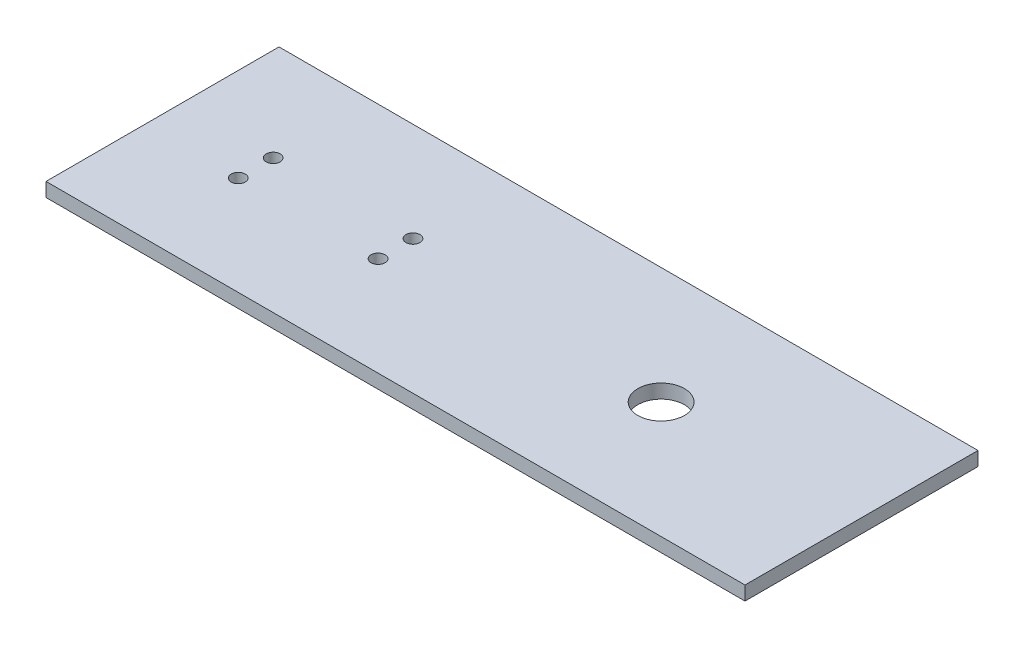
ISO-10303-21;
HEADER;
FILE_DESCRIPTION(('STEP AP214'),'2;1');
FILE_NAME('part.step','',(''),(''),'','','');
FILE_SCHEMA(('AUTOMOTIVE_DESIGN { 1 0 10303 214 1 1 1 1 }'));
ENDSEC;
DATA;
#1=APPLICATION_CONTEXT('core data for automotive mechanical design processes');
#2=APPLICATION_PROTOCOL_DEFINITION('international standard','automotive_design',2000,#1);
#3=PRODUCT_CONTEXT('',#1,'mechanical');
#4=PRODUCT('Part','Part','',(#3));
#5=PRODUCT_RELATED_PRODUCT_CATEGORY('part','',(#4));
#6=PRODUCT_DEFINITION_FORMATION('','',#4);
#7=PRODUCT_DEFINITION_CONTEXT('part definition',#1,'design');
#8=PRODUCT_DEFINITION('design','',#6,#7);
#9=PRODUCT_DEFINITION_SHAPE('','',#8);
#10=(LENGTH_UNIT() NAMED_UNIT(*) SI_UNIT(.MILLI.,.METRE.));
#11=(NAMED_UNIT(*) PLANE_ANGLE_UNIT() SI_UNIT($,.RADIAN.));
#12=(NAMED_UNIT(*) SI_UNIT($,.STERADIAN.) SOLID_ANGLE_UNIT());
#13=UNCERTAINTY_MEASURE_WITH_UNIT(LENGTH_MEASURE(1.E-05),#10,'distance_accuracy_value','');
#14=(GEOMETRIC_REPRESENTATION_CONTEXT(3) GLOBAL_UNCERTAINTY_ASSIGNED_CONTEXT((#13)) GLOBAL_UNIT_ASSIGNED_CONTEXT((#10,
#11,#12)) REPRESENTATION_CONTEXT('',''));
#15=CARTESIAN_POINT('',(0.,0.,0.));
#16=DIRECTION('',(0.,0.,1.));
#17=DIRECTION('',(1.,0.,0.));
#18=AXIS2_PLACEMENT_3D('',#15,#16,#17);
#19=CARTESIAN_POINT('',(75.,3.,25.));
#20=DIRECTION('',(-1.,0.,0.));
#21=DIRECTION('',(0.,0.,1.));
#22=AXIS2_PLACEMENT_3D('',#19,#20,#21);
#23=PLANE('',#22);
#24=DIRECTION('',(0.,0.,-1.));
#25=VECTOR('',#24,1.);
#26=CARTESIAN_POINT('',(75.,0.,25.));
#27=LINE('',#26,#25);
#28=CARTESIAN_POINT('',(75.,0.,25.));
#29=VERTEX_POINT('',#28);
#30=CARTESIAN_POINT('',(75.,0.,-25.));
#31=VERTEX_POINT('',#30);
#32=EDGE_CURVE('E106',#29,#31,#27,.T.);
#33=ORIENTED_EDGE('',*,*,#32,.T.);
#34=DIRECTION('',(0.,-1.,0.));
#35=VECTOR('',#34,1.);
#36=CARTESIAN_POINT('',(75.,3.,-25.));
#37=LINE('',#36,#35);
#38=CARTESIAN_POINT('',(75.,3.,-25.));
#39=VERTEX_POINT('',#38);
#40=EDGE_CURVE('E11',#39,#31,#37,.T.);
#41=ORIENTED_EDGE('',*,*,#40,.F.);
#42=DIRECTION('',(0.,0.,-1.));
#43=VECTOR('',#42,1.);
#44=CARTESIAN_POINT('',(75.,3.,25.));
#45=LINE('',#44,#43);
#46=CARTESIAN_POINT('',(75.,3.,25.));
#47=VERTEX_POINT('',#46);
#48=EDGE_CURVE('E90',#47,#39,#45,.T.);
#49=ORIENTED_EDGE('',*,*,#48,.F.);
#50=DIRECTION('',(0.,-1.,0.));
#51=VECTOR('',#50,1.);
#52=CARTESIAN_POINT('',(75.,3.,25.));
#53=LINE('',#52,#51);
#54=EDGE_CURVE('E102',#47,#29,#53,.T.);
#55=ORIENTED_EDGE('',*,*,#54,.T.);
#56=EDGE_LOOP('',(#33,#41,#49,#55));
#57=FACE_BOUND('',#56,.T.);
#58=ADVANCED_FACE('F38',(#57),#23,.F.);
#59=CARTESIAN_POINT('',(-75.,3.,-25.));
#60=DIRECTION('',(0.,0.,1.));
#61=DIRECTION('',(1.,0.,0.));
#62=AXIS2_PLACEMENT_3D('',#59,#60,#61);
#63=PLANE('',#62);
#64=DIRECTION('',(-1.,0.,0.));
#65=VECTOR('',#64,1.);
#66=CARTESIAN_POINT('',(-75.,0.,-25.));
#67=LINE('',#66,#65);
#68=CARTESIAN_POINT('',(-75.,0.,-25.));
#69=VERTEX_POINT('',#68);
#70=EDGE_CURVE('E95',#31,#69,#67,.T.);
#71=ORIENTED_EDGE('',*,*,#70,.T.);
#72=DIRECTION('',(0.,-1.,0.));
#73=VECTOR('',#72,1.);
#74=CARTESIAN_POINT('',(-75.,3.,-25.));
#75=LINE('',#74,#73);
#76=CARTESIAN_POINT('',(-75.,3.,-25.));
#77=VERTEX_POINT('',#76);
#78=EDGE_CURVE('E47',#77,#69,#75,.T.);
#79=ORIENTED_EDGE('',*,*,#78,.F.);
#80=DIRECTION('',(-1.,0.,0.));
#81=VECTOR('',#80,1.);
#82=CARTESIAN_POINT('',(-75.,3.,-25.));
#83=LINE('',#82,#81);
#84=EDGE_CURVE('E85',#39,#77,#83,.T.);
#85=ORIENTED_EDGE('',*,*,#84,.F.);
#86=ORIENTED_EDGE('',*,*,#40,.T.);
#87=EDGE_LOOP('',(#71,#79,#85,#86));
#88=FACE_BOUND('',#87,.T.);
#89=ADVANCED_FACE('F94',(#88),#63,.F.);
#90=CARTESIAN_POINT('',(-75.,3.,25.));
#91=DIRECTION('',(1.,0.,0.));
#92=DIRECTION('',(0.,0.,-1.));
#93=AXIS2_PLACEMENT_3D('',#90,#91,#92);
#94=PLANE('',#93);
#95=DIRECTION('',(0.,0.,1.));
#96=VECTOR('',#95,1.);
#97=CARTESIAN_POINT('',(-75.,0.,25.));
#98=LINE('',#97,#96);
#99=CARTESIAN_POINT('',(-75.,0.,25.));
#100=VERTEX_POINT('',#99);
#101=EDGE_CURVE('E72',#69,#100,#98,.T.);
#102=ORIENTED_EDGE('',*,*,#101,.T.);
#103=DIRECTION('',(0.,-1.,0.));
#104=VECTOR('',#103,1.);
#105=CARTESIAN_POINT('',(-75.,3.,25.));
#106=LINE('',#105,#104);
#107=CARTESIAN_POINT('',(-75.,3.,25.));
#108=VERTEX_POINT('',#107);
#109=EDGE_CURVE('E97',#108,#100,#106,.T.);
#110=ORIENTED_EDGE('',*,*,#109,.F.);
#111=DIRECTION('',(0.,0.,1.));
#112=VECTOR('',#111,1.);
#113=CARTESIAN_POINT('',(-75.,3.,25.));
#114=LINE('',#113,#112);
#115=EDGE_CURVE('E88',#77,#108,#114,.T.);
#116=ORIENTED_EDGE('',*,*,#115,.F.);
#117=ORIENTED_EDGE('',*,*,#78,.T.);
#118=EDGE_LOOP('',(#102,#110,#116,#117));
#119=FACE_BOUND('',#118,.T.);
#120=ADVANCED_FACE('F98',(#119),#94,.F.);
#121=CARTESIAN_POINT('',(-75.,3.,25.));
#122=DIRECTION('',(0.,0.,-1.));
#123=DIRECTION('',(-1.,0.,0.));
#124=AXIS2_PLACEMENT_3D('',#121,#122,#123);
#125=PLANE('',#124);
#126=DIRECTION('',(1.,0.,0.));
#127=VECTOR('',#126,1.);
#128=CARTESIAN_POINT('',(-75.,0.,25.));
#129=LINE('',#128,#127);
#130=EDGE_CURVE('E78',#100,#29,#129,.T.);
#131=ORIENTED_EDGE('',*,*,#130,.T.);
#132=ORIENTED_EDGE('',*,*,#54,.F.);
#133=DIRECTION('',(1.,0.,0.));
#134=VECTOR('',#133,1.);
#135=CARTESIAN_POINT('',(-75.,3.,25.));
#136=LINE('',#135,#134);
#137=EDGE_CURVE('E55',#108,#47,#136,.T.);
#138=ORIENTED_EDGE('',*,*,#137,.F.);
#139=ORIENTED_EDGE('',*,*,#109,.T.);
#140=EDGE_LOOP('',(#131,#132,#138,#139));
#141=FACE_BOUND('',#140,.T.);
#142=ADVANCED_FACE('F120',(#141),#125,.F.);
#143=CARTESIAN_POINT('',(0.,3.,0.));
#144=DIRECTION('',(0.,-1.,0.));
#145=DIRECTION('',(0.,0.,-1.));
#146=AXIS2_PLACEMENT_3D('',#143,#144,#145);
#147=PLANE('',#146);
#148=CARTESIAN_POINT('',(32.,3.,0.));
#149=DIRECTION('',(0.,1.,0.));
#150=DIRECTION('',(0.,0.,1.));
#151=AXIS2_PLACEMENT_3D('',#148,#149,#150);
#152=CIRCLE('',#151,5.);
#153=CARTESIAN_POINT('',(32.,3.,5.));
#154=VERTEX_POINT('',#153);
#155=EDGE_CURVE('E159',#154,#154,#152,.T.);
#156=ORIENTED_EDGE('',*,*,#155,.F.);
#157=EDGE_LOOP('',(#156));
#158=FACE_BOUND('',#157,.T.);
#159=CARTESIAN_POINT('',(-25.,3.,-3.75));
#160=DIRECTION('',(0.,-1.,0.));
#161=DIRECTION('',(0.,0.,-1.));
#162=AXIS2_PLACEMENT_3D('',#159,#160,#161);
#163=CIRCLE('',#162,1.5);
#164=CARTESIAN_POINT('',(-25.,3.,-5.25));
#165=VERTEX_POINT('',#164);
#166=EDGE_CURVE('E110',#165,#165,#163,.T.);
#167=ORIENTED_EDGE('',*,*,#166,.T.);
#168=EDGE_LOOP('',(#167));
#169=FACE_BOUND('',#168,.T.);
#170=CARTESIAN_POINT('',(-25.,3.,3.75));
#171=DIRECTION('',(0.,-1.,0.));
#172=DIRECTION('',(0.,0.,-1.));
#173=AXIS2_PLACEMENT_3D('',#170,#171,#172);
#174=CIRCLE('',#173,1.5);
#175=CARTESIAN_POINT('',(-25.,3.,2.25));
#176=VERTEX_POINT('',#175);
#177=EDGE_CURVE('E130',#176,#176,#174,.T.);
#178=ORIENTED_EDGE('',*,*,#177,.T.);
#179=EDGE_LOOP('',(#178));
#180=FACE_BOUND('',#179,.T.);
#181=CARTESIAN_POINT('',(-55.,3.,3.75));
#182=DIRECTION('',(0.,-1.,0.));
#183=DIRECTION('',(0.,0.,-1.));
#184=AXIS2_PLACEMENT_3D('',#181,#182,#183);
#185=CIRCLE('',#184,1.5);
#186=CARTESIAN_POINT('',(-55.,3.,2.25));
#187=VERTEX_POINT('',#186);
#188=EDGE_CURVE('E134',#187,#187,#185,.T.);
#189=ORIENTED_EDGE('',*,*,#188,.T.);
#190=EDGE_LOOP('',(#189));
#191=FACE_BOUND('',#190,.T.);
#192=CARTESIAN_POINT('',(-55.,3.,-3.75));
#193=DIRECTION('',(0.,-1.,0.));
#194=DIRECTION('',(0.,0.,-1.));
#195=AXIS2_PLACEMENT_3D('',#192,#193,#194);
#196=CIRCLE('',#195,1.5);
#197=CARTESIAN_POINT('',(-55.,3.,-5.25));
#198=VERTEX_POINT('',#197);
#199=EDGE_CURVE('E138',#198,#198,#196,.T.);
#200=ORIENTED_EDGE('',*,*,#199,.T.);
#201=EDGE_LOOP('',(#200));
#202=FACE_BOUND('',#201,.T.);
#203=ORIENTED_EDGE('',*,*,#48,.T.);
#204=ORIENTED_EDGE('',*,*,#84,.T.);
#205=ORIENTED_EDGE('',*,*,#115,.T.);
#206=ORIENTED_EDGE('',*,*,#137,.T.);
#207=EDGE_LOOP('',(#203,#204,#205,#206));
#208=FACE_BOUND('',#207,.T.);
#209=ADVANCED_FACE('F86',(#158,#169,#180,#191,#202,#208),#147,.F.);
#210=CARTESIAN_POINT('',(0.,0.,0.));
#211=DIRECTION('',(0.,-1.,0.));
#212=DIRECTION('',(0.,0.,-1.));
#213=AXIS2_PLACEMENT_3D('',#210,#211,#212);
#214=PLANE('',#213);
#215=CARTESIAN_POINT('',(32.,0.,0.));
#216=DIRECTION('',(0.,1.,0.));
#217=DIRECTION('',(0.,0.,1.));
#218=AXIS2_PLACEMENT_3D('',#215,#216,#217);
#219=CIRCLE('',#218,5.);
#220=CARTESIAN_POINT('',(32.,0.,5.));
#221=VERTEX_POINT('',#220);
#222=EDGE_CURVE('E152',#221,#221,#219,.T.);
#223=ORIENTED_EDGE('',*,*,#222,.T.);
#224=EDGE_LOOP('',(#223));
#225=FACE_BOUND('',#224,.T.);
#226=CARTESIAN_POINT('',(-25.,0.,-3.75));
#227=DIRECTION('',(0.,1.,0.));
#228=DIRECTION('',(0.,0.,-1.));
#229=AXIS2_PLACEMENT_3D('',#226,#227,#228);
#230=CIRCLE('',#229,1.5);
#231=CARTESIAN_POINT('',(-25.,0.,-5.25));
#232=VERTEX_POINT('',#231);
#233=EDGE_CURVE('E147',#232,#232,#230,.T.);
#234=ORIENTED_EDGE('',*,*,#233,.T.);
#235=EDGE_LOOP('',(#234));
#236=FACE_BOUND('',#235,.T.);
#237=CARTESIAN_POINT('',(-25.,0.,3.75));
#238=DIRECTION('',(0.,1.,0.));
#239=DIRECTION('',(0.,0.,1.));
#240=AXIS2_PLACEMENT_3D('',#237,#238,#239);
#241=CIRCLE('',#240,1.5);
#242=CARTESIAN_POINT('',(-25.,0.,5.25));
#243=VERTEX_POINT('',#242);
#244=EDGE_CURVE('E151',#243,#243,#241,.T.);
#245=ORIENTED_EDGE('',*,*,#244,.T.);
#246=EDGE_LOOP('',(#245));
#247=FACE_BOUND('',#246,.T.);
#248=CARTESIAN_POINT('',(-55.,0.,3.75));
#249=DIRECTION('',(0.,1.,0.));
#250=DIRECTION('',(0.,0.,-1.));
#251=AXIS2_PLACEMENT_3D('',#248,#249,#250);
#252=CIRCLE('',#251,1.5);
#253=CARTESIAN_POINT('',(-55.,0.,2.25));
#254=VERTEX_POINT('',#253);
#255=EDGE_CURVE('E146',#254,#254,#252,.T.);
#256=ORIENTED_EDGE('',*,*,#255,.T.);
#257=EDGE_LOOP('',(#256));
#258=FACE_BOUND('',#257,.T.);
#259=CARTESIAN_POINT('',(-55.,0.,-3.75));
#260=DIRECTION('',(0.,1.,0.));
#261=DIRECTION('',(0.,0.,1.));
#262=AXIS2_PLACEMENT_3D('',#259,#260,#261);
#263=CIRCLE('',#262,1.5);
#264=CARTESIAN_POINT('',(-55.,0.,-2.25));
#265=VERTEX_POINT('',#264);
#266=EDGE_CURVE('E142',#265,#265,#263,.T.);
#267=ORIENTED_EDGE('',*,*,#266,.T.);
#268=EDGE_LOOP('',(#267));
#269=FACE_BOUND('',#268,.T.);
#270=ORIENTED_EDGE('',*,*,#32,.F.);
#271=ORIENTED_EDGE('',*,*,#130,.F.);
#272=ORIENTED_EDGE('',*,*,#101,.F.);
#273=ORIENTED_EDGE('',*,*,#70,.F.);
#274=EDGE_LOOP('',(#270,#271,#272,#273));
#275=FACE_BOUND('',#274,.T.);
#276=ADVANCED_FACE('F123',(#225,#236,#247,#258,#269,#275),#214,.T.);
#277=CARTESIAN_POINT('',(-55.,0.,-3.75));
#278=DIRECTION('',(0.,1.,0.));
#279=DIRECTION('',(0.,0.,1.));
#280=AXIS2_PLACEMENT_3D('',#277,#278,#279);
#281=CYLINDRICAL_SURFACE('',#280,1.5);
#282=ORIENTED_EDGE('',*,*,#266,.F.);
#283=EDGE_LOOP('',(#282));
#284=FACE_BOUND('',#283,.T.);
#285=ORIENTED_EDGE('',*,*,#199,.F.);
#286=EDGE_LOOP('',(#285));
#287=FACE_BOUND('',#286,.T.);
#288=ADVANCED_FACE('F187',(#284,#287),#281,.F.);
#289=CARTESIAN_POINT('',(-55.,0.,3.75));
#290=DIRECTION('',(0.,1.,0.));
#291=DIRECTION('',(0.,0.,1.));
#292=AXIS2_PLACEMENT_3D('',#289,#290,#291);
#293=CYLINDRICAL_SURFACE('',#292,1.5);
#294=ORIENTED_EDGE('',*,*,#255,.F.);
#295=EDGE_LOOP('',(#294));
#296=FACE_BOUND('',#295,.T.);
#297=ORIENTED_EDGE('',*,*,#188,.F.);
#298=EDGE_LOOP('',(#297));
#299=FACE_BOUND('',#298,.T.);
#300=ADVANCED_FACE('F189',(#296,#299),#293,.F.);
#301=CARTESIAN_POINT('',(-25.,0.,3.75));
#302=DIRECTION('',(0.,1.,0.));
#303=DIRECTION('',(0.,0.,1.));
#304=AXIS2_PLACEMENT_3D('',#301,#302,#303);
#305=CYLINDRICAL_SURFACE('',#304,1.5);
#306=ORIENTED_EDGE('',*,*,#244,.F.);
#307=EDGE_LOOP('',(#306));
#308=FACE_BOUND('',#307,.T.);
#309=ORIENTED_EDGE('',*,*,#177,.F.);
#310=EDGE_LOOP('',(#309));
#311=FACE_BOUND('',#310,.T.);
#312=ADVANCED_FACE('F196',(#308,#311),#305,.F.);
#313=CARTESIAN_POINT('',(-25.,0.,-3.75));
#314=DIRECTION('',(0.,1.,0.));
#315=DIRECTION('',(0.,0.,1.));
#316=AXIS2_PLACEMENT_3D('',#313,#314,#315);
#317=CYLINDRICAL_SURFACE('',#316,1.5);
#318=ORIENTED_EDGE('',*,*,#233,.F.);
#319=EDGE_LOOP('',(#318));
#320=FACE_BOUND('',#319,.T.);
#321=ORIENTED_EDGE('',*,*,#166,.F.);
#322=EDGE_LOOP('',(#321));
#323=FACE_BOUND('',#322,.T.);
#324=ADVANCED_FACE('F172',(#320,#323),#317,.F.);
#325=CARTESIAN_POINT('',(32.,0.,0.));
#326=DIRECTION('',(0.,1.,0.));
#327=DIRECTION('',(0.,0.,1.));
#328=AXIS2_PLACEMENT_3D('',#325,#326,#327);
#329=CYLINDRICAL_SURFACE('',#328,5.);
#330=ORIENTED_EDGE('',*,*,#222,.F.);
#331=EDGE_LOOP('',(#330));
#332=FACE_BOUND('',#331,.T.);
#333=ORIENTED_EDGE('',*,*,#155,.T.);
#334=EDGE_LOOP('',(#333));
#335=FACE_BOUND('',#334,.T.);
#336=ADVANCED_FACE('F169',(#332,#335),#329,.F.);
#337=CLOSED_SHELL('',(#58,#89,#120,#142,#209,#276,#288,#300,#312,#324,#336));
#338=MANIFOLD_SOLID_BREP('B2',#337);
#339=ADVANCED_BREP_SHAPE_REPRESENTATION('',(#18,#338),#14);
#340=SHAPE_DEFINITION_REPRESENTATION(#9,#339);
ENDSEC;
END-ISO-10303-21;
